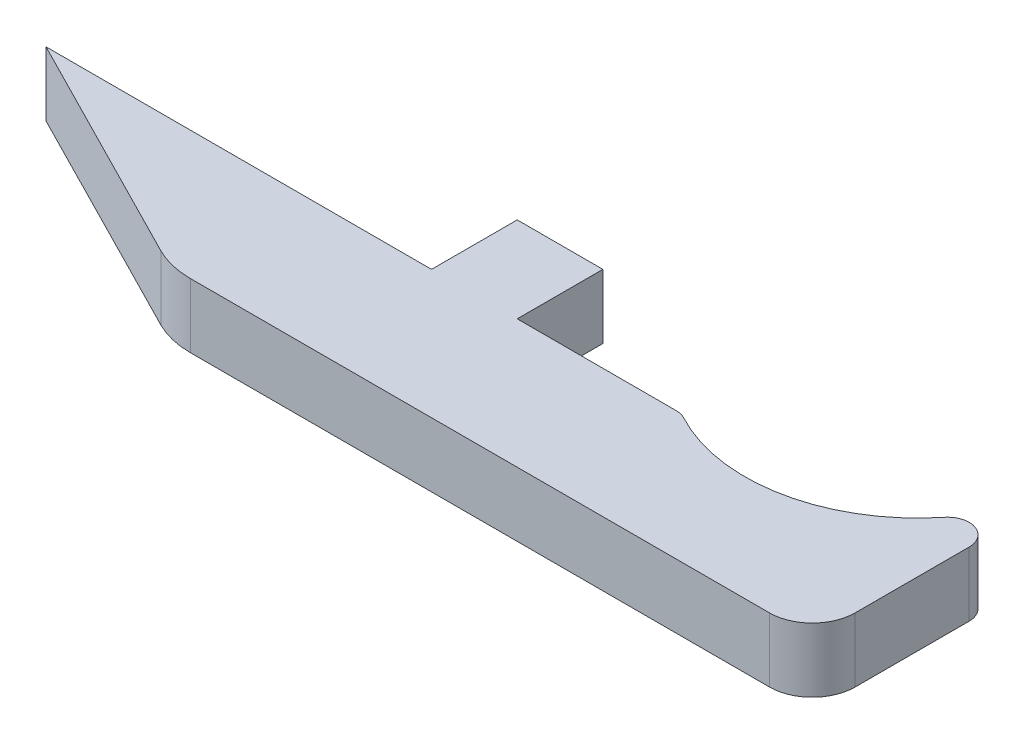
ISO-10303-21;
HEADER;
FILE_DESCRIPTION(('STEP AP214'),'2;1');
FILE_NAME('part.step','',(''),(''),'','','');
FILE_SCHEMA(('AUTOMOTIVE_DESIGN { 1 0 10303 214 1 1 1 1 }'));
ENDSEC;
DATA;
#1=APPLICATION_CONTEXT('core data for automotive mechanical design processes');
#2=APPLICATION_PROTOCOL_DEFINITION('international standard','automotive_design',2000,#1);
#3=PRODUCT_CONTEXT('',#1,'mechanical');
#4=PRODUCT('Part','Part','',(#3));
#5=PRODUCT_RELATED_PRODUCT_CATEGORY('part','',(#4));
#6=PRODUCT_DEFINITION_FORMATION('','',#4);
#7=PRODUCT_DEFINITION_CONTEXT('part definition',#1,'design');
#8=PRODUCT_DEFINITION('design','',#6,#7);
#9=PRODUCT_DEFINITION_SHAPE('','',#8);
#10=(LENGTH_UNIT() NAMED_UNIT(*) SI_UNIT(.MILLI.,.METRE.));
#11=(NAMED_UNIT(*) PLANE_ANGLE_UNIT() SI_UNIT($,.RADIAN.));
#12=(NAMED_UNIT(*) SI_UNIT($,.STERADIAN.) SOLID_ANGLE_UNIT());
#13=UNCERTAINTY_MEASURE_WITH_UNIT(LENGTH_MEASURE(1.E-05),#10,'distance_accuracy_value','');
#14=(GEOMETRIC_REPRESENTATION_CONTEXT(3) GLOBAL_UNCERTAINTY_ASSIGNED_CONTEXT((#13)) GLOBAL_UNIT_ASSIGNED_CONTEXT((#10,
#11,#12)) REPRESENTATION_CONTEXT('',''));
#15=CARTESIAN_POINT('',(0.,0.,0.));
#16=DIRECTION('',(0.,0.,1.));
#17=DIRECTION('',(1.,0.,0.));
#18=AXIS2_PLACEMENT_3D('',#15,#16,#17);
#19=CARTESIAN_POINT('',(0.,4.7625,13.8171684160711));
#20=DIRECTION('',(0.,0.,1.));
#21=DIRECTION('',(1.,0.,0.));
#22=AXIS2_PLACEMENT_3D('',#19,#20,#21);
#23=PLANE('',#22);
#24=DIRECTION('',(1.18015833326296E-13,-1.,0.));
#25=VECTOR('',#24,1.);
#26=CARTESIAN_POINT('',(40.4474999999188,4.7625,13.8171684160711));
#27=LINE('',#26,#25);
#28=CARTESIAN_POINT('',(40.4474999999194,4.7625,13.8171684160711));
#29=VERTEX_POINT('',#28);
#30=CARTESIAN_POINT('',(40.4474999999194,0.,13.8171684160711));
#31=VERTEX_POINT('',#30);
#32=EDGE_CURVE('E66',#29,#31,#27,.T.);
#33=ORIENTED_EDGE('',*,*,#32,.F.);
#34=DIRECTION('',(-1.,0.,0.));
#35=VECTOR('',#34,1.);
#36=CARTESIAN_POINT('',(0.,4.7625,13.8171684160711));
#37=LINE('',#36,#35);
#38=CARTESIAN_POINT('',(52.2236118690828,4.7625,13.8171684160711));
#39=VERTEX_POINT('',#38);
#40=EDGE_CURVE('E176',#39,#29,#37,.T.);
#41=ORIENTED_EDGE('',*,*,#40,.F.);
#42=DIRECTION('',(0.,1.,0.));
#43=VECTOR('',#42,1.);
#44=CARTESIAN_POINT('',(52.2236118690828,0.,13.8171684160711));
#45=LINE('',#44,#43);
#46=CARTESIAN_POINT('',(52.2236118690828,0.,13.8171684160711));
#47=VERTEX_POINT('',#46);
#48=EDGE_CURVE('E199',#39,#47,#45,.F.);
#49=ORIENTED_EDGE('',*,*,#48,.T.);
#50=DIRECTION('',(-1.,0.,0.));
#51=VECTOR('',#50,1.);
#52=CARTESIAN_POINT('',(0.,0.,13.8171684160711));
#53=LINE('',#52,#51);
#54=EDGE_CURVE('E188',#47,#31,#53,.T.);
#55=ORIENTED_EDGE('',*,*,#54,.T.);
#56=EDGE_LOOP('',(#33,#41,#49,#55));
#57=FACE_BOUND('',#56,.T.);
#58=ADVANCED_FACE('F43',(#57),#23,.F.);
#59=DIRECTION('',(-1.16558847729675E-13,1.,0.));
#60=VECTOR('',#59,1.);
#61=CARTESIAN_POINT('',(34.0974999999188,4.7625,13.8171684160711));
#62=LINE('',#61,#60);
#63=CARTESIAN_POINT('',(34.0974999999194,0.,13.8171684160711));
#64=VERTEX_POINT('',#63);
#65=CARTESIAN_POINT('',(34.0974999999188,4.7625,13.8171684160711));
#66=VERTEX_POINT('',#65);
#67=EDGE_CURVE('E160',#64,#66,#62,.T.);
#68=ORIENTED_EDGE('',*,*,#67,.F.);
#69=CARTESIAN_POINT('',(5.52249999991881,0.,13.8171684160711));
#70=VERTEX_POINT('',#69);
#71=EDGE_CURVE('E166',#64,#70,#53,.T.);
#72=ORIENTED_EDGE('',*,*,#71,.T.);
#73=DIRECTION('',(0.,-1.,0.));
#74=VECTOR('',#73,1.);
#75=CARTESIAN_POINT('',(5.52249999991881,4.7625,13.8171684160711));
#76=LINE('',#75,#74);
#77=CARTESIAN_POINT('',(5.52249999991881,4.7625,13.8171684160711));
#78=VERTEX_POINT('',#77);
#79=EDGE_CURVE('E186',#78,#70,#76,.T.);
#80=ORIENTED_EDGE('',*,*,#79,.F.);
#81=EDGE_CURVE('E58',#66,#78,#37,.T.);
#82=ORIENTED_EDGE('',*,*,#81,.F.);
#83=EDGE_LOOP('',(#68,#72,#80,#82));
#84=FACE_BOUND('',#83,.T.);
#85=ADVANCED_FACE('F271',(#84),#23,.F.);
#86=CARTESIAN_POINT('',(59.0180999999136,4.7625,2.69196841607107));
#87=DIRECTION('',(0.,-1.,0.));
#88=DIRECTION('',(0.,0.,-1.));
#89=AXIS2_PLACEMENT_3D('',#86,#87,#88);
#90=CYLINDRICAL_SURFACE('',#89,12.827);
#91=CARTESIAN_POINT('',(59.0180999999136,0.,2.69196841607107));
#92=DIRECTION('',(0.,1.,0.));
#93=DIRECTION('',(0.,0.,1.));
#94=AXIS2_PLACEMENT_3D('',#91,#92,#93);
#95=CIRCLE('',#94,12.827);
#96=CARTESIAN_POINT('',(52.9719035134474,0.,14.0045913235601));
#97=VERTEX_POINT('',#96);
#98=CARTESIAN_POINT('',(69.0197696034378,0.,10.7230663573204));
#99=VERTEX_POINT('',#98);
#100=EDGE_CURVE('E163',#97,#99,#95,.T.);
#101=ORIENTED_EDGE('',*,*,#100,.F.);
#102=DIRECTION('',(0.,-1.,0.));
#103=VECTOR('',#102,1.);
#104=CARTESIAN_POINT('',(52.9719035134474,4.7625,14.0045913235601));
#105=LINE('',#104,#103);
#106=CARTESIAN_POINT('',(52.9719035134474,4.7625,14.0045913235601));
#107=VERTEX_POINT('',#106);
#108=EDGE_CURVE('E209',#97,#107,#105,.F.);
#109=ORIENTED_EDGE('',*,*,#108,.T.);
#110=CARTESIAN_POINT('',(59.0180999999136,4.7625,2.69196841607107));
#111=DIRECTION('',(0.,1.,0.));
#112=DIRECTION('',(0.,0.,1.));
#113=AXIS2_PLACEMENT_3D('',#110,#111,#112);
#114=CIRCLE('',#113,12.827);
#115=CARTESIAN_POINT('',(69.0197696034378,4.7625,10.7230663573204));
#116=VERTEX_POINT('',#115);
#117=EDGE_CURVE('E172',#107,#116,#114,.T.);
#118=ORIENTED_EDGE('',*,*,#117,.T.);
#119=DIRECTION('',(0.,-1.,0.));
#120=VECTOR('',#119,1.);
#121=CARTESIAN_POINT('',(69.0197696034378,4.7625,10.7230663573204));
#122=LINE('',#121,#120);
#123=EDGE_CURVE('E206',#116,#99,#122,.T.);
#124=ORIENTED_EDGE('',*,*,#123,.T.);
#125=EDGE_LOOP('',(#101,#109,#118,#124));
#126=FACE_BOUND('',#125,.T.);
#127=ADVANCED_FACE('F253',(#126),#90,.F.);
#128=CARTESIAN_POINT('',(-4.45063872227655,4.7625,8.73661549329288));
#129=DIRECTION('',(0.453918499731843,0.,-0.891043206360496));
#130=DIRECTION('',(-0.891043206360496,0.,-0.453918499731843));
#131=AXIS2_PLACEMENT_3D('',#128,#129,#130);
#132=PLANE('',#131);
#133=DIRECTION('',(0.891043206360496,0.,0.453918499731843));
#134=VECTOR('',#133,1.);
#135=CARTESIAN_POINT('',(-4.45063872227655,0.,8.73661549329288));
#136=LINE('',#135,#134);
#137=CARTESIAN_POINT('',(22.8619463034113,0.,22.6502927764602));
#138=VERTEX_POINT('',#137);
#139=EDGE_CURVE('E190',#70,#138,#136,.T.);
#140=ORIENTED_EDGE('',*,*,#139,.T.);
#141=DIRECTION('',(0.,-1.,0.));
#142=VECTOR('',#141,1.);
#143=CARTESIAN_POINT('',(22.8619463034113,4.7625,22.6502927764602));
#144=LINE('',#143,#142);
#145=CARTESIAN_POINT('',(22.8619463034113,4.7625,22.6502927764602));
#146=VERTEX_POINT('',#145);
#147=EDGE_CURVE('E222',#138,#146,#144,.F.);
#148=ORIENTED_EDGE('',*,*,#147,.T.);
#149=DIRECTION('',(0.891043206360496,0.,0.453918499731843));
#150=VECTOR('',#149,1.);
#151=CARTESIAN_POINT('',(-4.45063872227655,4.7625,8.73661549329288));
#152=LINE('',#151,#150);
#153=EDGE_CURVE('E178',#78,#146,#152,.T.);
#154=ORIENTED_EDGE('',*,*,#153,.F.);
#155=ORIENTED_EDGE('',*,*,#79,.T.);
#156=EDGE_LOOP('',(#140,#148,#154,#155));
#157=FACE_BOUND('',#156,.T.);
#158=ADVANCED_FACE('F274',(#157),#132,.F.);
#159=CARTESIAN_POINT('',(0.,4.7625,23.3421684160711));
#160=DIRECTION('',(0.,0.,-1.));
#161=DIRECTION('',(-1.,0.,0.));
#162=AXIS2_PLACEMENT_3D('',#159,#160,#161);
#163=PLANE('',#162);
#164=DIRECTION('',(1.,0.,0.));
#165=VECTOR('',#164,1.);
#166=CARTESIAN_POINT('',(0.,0.,23.3421684160711));
#167=LINE('',#166,#165);
#168=CARTESIAN_POINT('',(25.7443287767085,0.,23.3421684160711));
#169=VERTEX_POINT('',#168);
#170=CARTESIAN_POINT('',(68.6700999999135,0.,23.3421684160711));
#171=VERTEX_POINT('',#170);
#172=EDGE_CURVE('E193',#169,#171,#167,.T.);
#173=ORIENTED_EDGE('',*,*,#172,.T.);
#174=DIRECTION('',(0.,-1.,0.));
#175=VECTOR('',#174,1.);
#176=CARTESIAN_POINT('',(68.6700999999135,4.7625,23.3421684160711));
#177=LINE('',#176,#175);
#178=CARTESIAN_POINT('',(68.6700999999135,4.7625,23.3421684160711));
#179=VERTEX_POINT('',#178);
#180=EDGE_CURVE('E51',#171,#179,#177,.F.);
#181=ORIENTED_EDGE('',*,*,#180,.T.);
#182=DIRECTION('',(1.,0.,0.));
#183=VECTOR('',#182,1.);
#184=CARTESIAN_POINT('',(0.,4.7625,23.3421684160711));
#185=LINE('',#184,#183);
#186=CARTESIAN_POINT('',(25.7443287767085,4.7625,23.3421684160711));
#187=VERTEX_POINT('',#186);
#188=EDGE_CURVE('E181',#187,#179,#185,.T.);
#189=ORIENTED_EDGE('',*,*,#188,.F.);
#190=DIRECTION('',(0.,-1.,0.));
#191=VECTOR('',#190,1.);
#192=CARTESIAN_POINT('',(25.7443287767085,4.7625,23.3421684160711));
#193=LINE('',#192,#191);
#194=EDGE_CURVE('E217',#187,#169,#193,.T.);
#195=ORIENTED_EDGE('',*,*,#194,.T.);
#196=EDGE_LOOP('',(#173,#181,#189,#195));
#197=FACE_BOUND('',#196,.T.);
#198=ADVANCED_FACE('F233',(#197),#163,.F.);
#199=CARTESIAN_POINT('',(71.8450999999136,4.7625,0.));
#200=DIRECTION('',(1.,0.,0.));
#201=DIRECTION('',(0.,0.,-1.));
#202=AXIS2_PLACEMENT_3D('',#199,#200,#201);
#203=PLANE('',#202);
#204=DIRECTION('',(0.,0.,1.));
#205=VECTOR('',#204,1.);
#206=CARTESIAN_POINT('',(71.8450999999136,4.7625,0.));
#207=LINE('',#206,#205);
#208=CARTESIAN_POINT('',(71.8450999999135,4.7625,11.7170141223265));
#209=VERTEX_POINT('',#208);
#210=CARTESIAN_POINT('',(71.8450999999135,4.7625,20.1671684160711));
#211=VERTEX_POINT('',#210);
#212=EDGE_CURVE('E184',#209,#211,#207,.T.);
#213=ORIENTED_EDGE('',*,*,#212,.T.);
#214=DIRECTION('',(0.,-1.,0.));
#215=VECTOR('',#214,1.);
#216=CARTESIAN_POINT('',(71.8450999999135,0.,20.1671684160711));
#217=LINE('',#216,#215);
#218=CARTESIAN_POINT('',(71.8450999999135,0.,20.1671684160711));
#219=VERTEX_POINT('',#218);
#220=EDGE_CURVE('E226',#211,#219,#217,.T.);
#221=ORIENTED_EDGE('',*,*,#220,.T.);
#222=DIRECTION('',(0.,0.,1.));
#223=VECTOR('',#222,1.);
#224=CARTESIAN_POINT('',(71.8450999999136,0.,0.));
#225=LINE('',#224,#223);
#226=CARTESIAN_POINT('',(71.8450999999135,0.,11.7170141223265));
#227=VERTEX_POINT('',#226);
#228=EDGE_CURVE('E175',#227,#219,#225,.T.);
#229=ORIENTED_EDGE('',*,*,#228,.F.);
#230=DIRECTION('',(0.,-1.,0.));
#231=VECTOR('',#230,1.);
#232=CARTESIAN_POINT('',(71.8450999999135,4.7625,11.7170141223265));
#233=LINE('',#232,#231);
#234=EDGE_CURVE('E215',#227,#209,#233,.F.);
#235=ORIENTED_EDGE('',*,*,#234,.T.);
#236=EDGE_LOOP('',(#213,#221,#229,#235));
#237=FACE_BOUND('',#236,.T.);
#238=ADVANCED_FACE('F245',(#237),#203,.T.);
#239=CARTESIAN_POINT('',(0.,4.7625,0.));
#240=DIRECTION('',(0.,1.,0.));
#241=DIRECTION('',(0.,0.,1.));
#242=AXIS2_PLACEMENT_3D('',#239,#240,#241);
#243=PLANE('',#242);
#244=ORIENTED_EDGE('',*,*,#188,.T.);
#245=CARTESIAN_POINT('',(68.6700999999135,4.7625,20.1671684160711));
#246=DIRECTION('',(0.,1.,0.));
#247=DIRECTION('',(0.,0.,1.));
#248=AXIS2_PLACEMENT_3D('',#245,#246,#247);
#249=CIRCLE('',#248,3.175);
#250=EDGE_CURVE('E11',#179,#211,#249,.T.);
#251=ORIENTED_EDGE('',*,*,#250,.T.);
#252=ORIENTED_EDGE('',*,*,#212,.F.);
#253=CARTESIAN_POINT('',(70.2575999999136,4.7625,11.7170141223265));
#254=DIRECTION('',(0.,1.,0.));
#255=DIRECTION('',(0.,0.,1.));
#256=AXIS2_PLACEMENT_3D('',#253,#254,#255);
#257=CIRCLE('',#256,1.5875);
#258=EDGE_CURVE('E211',#209,#116,#257,.T.);
#259=ORIENTED_EDGE('',*,*,#258,.T.);
#260=ORIENTED_EDGE('',*,*,#117,.F.);
#261=CARTESIAN_POINT('',(52.2236118690828,4.7625,15.4046684160711));
#262=DIRECTION('',(0.,1.,0.));
#263=DIRECTION('',(0.,0.,1.));
#264=AXIS2_PLACEMENT_3D('',#261,#262,#263);
#265=CIRCLE('',#264,1.5875);
#266=EDGE_CURVE('E213',#107,#39,#265,.T.);
#267=ORIENTED_EDGE('',*,*,#266,.T.);
#268=ORIENTED_EDGE('',*,*,#40,.T.);
#269=DIRECTION('',(0.,0.,1.));
#270=VECTOR('',#269,1.);
#271=CARTESIAN_POINT('',(40.4474999999188,4.7625,7.46716841607107));
#272=LINE('',#271,#270);
#273=CARTESIAN_POINT('',(40.4474999999188,4.7625,7.46716841607107));
#274=VERTEX_POINT('',#273);
#275=EDGE_CURVE('E260',#274,#29,#272,.T.);
#276=ORIENTED_EDGE('',*,*,#275,.F.);
#277=DIRECTION('',(1.,0.,0.));
#278=VECTOR('',#277,1.);
#279=CARTESIAN_POINT('',(40.4474999999188,4.7625,7.46716841607107));
#280=LINE('',#279,#278);
#281=CARTESIAN_POINT('',(34.0974999999188,4.7625,7.46716841607107));
#282=VERTEX_POINT('',#281);
#283=EDGE_CURVE('E156',#282,#274,#280,.T.);
#284=ORIENTED_EDGE('',*,*,#283,.F.);
#285=DIRECTION('',(0.,0.,1.));
#286=VECTOR('',#285,1.);
#287=CARTESIAN_POINT('',(34.0974999999188,4.7625,7.46716841607107));
#288=LINE('',#287,#286);
#289=EDGE_CURVE('E168',#282,#66,#288,.T.);
#290=ORIENTED_EDGE('',*,*,#289,.T.);
#291=ORIENTED_EDGE('',*,*,#81,.T.);
#292=ORIENTED_EDGE('',*,*,#153,.T.);
#293=CARTESIAN_POINT('',(25.7443287767085,4.7625,16.9921684160711));
#294=DIRECTION('',(0.,1.,0.));
#295=DIRECTION('',(0.,0.,1.));
#296=AXIS2_PLACEMENT_3D('',#293,#294,#295);
#297=CIRCLE('',#296,6.35);
#298=EDGE_CURVE('E224',#146,#187,#297,.T.);
#299=ORIENTED_EDGE('',*,*,#298,.T.);
#300=EDGE_LOOP('',(#244,#251,#252,#259,#260,#267,#268,#276,#284,#290,#291,#292,#299));
#301=FACE_BOUND('',#300,.T.);
#302=ADVANCED_FACE('F239',(#301),#243,.T.);
#303=CARTESIAN_POINT('',(0.,0.,0.));
#304=DIRECTION('',(0.,1.,0.));
#305=DIRECTION('',(0.,0.,1.));
#306=AXIS2_PLACEMENT_3D('',#303,#304,#305);
#307=PLANE('',#306);
#308=ORIENTED_EDGE('',*,*,#228,.T.);
#309=CARTESIAN_POINT('',(68.6700999999135,0.,20.1671684160711));
#310=DIRECTION('',(0.,1.,0.));
#311=DIRECTION('',(0.,0.,1.));
#312=AXIS2_PLACEMENT_3D('',#309,#310,#311);
#313=CIRCLE('',#312,3.175);
#314=EDGE_CURVE('E229',#219,#171,#313,.F.);
#315=ORIENTED_EDGE('',*,*,#314,.T.);
#316=ORIENTED_EDGE('',*,*,#172,.F.);
#317=CARTESIAN_POINT('',(25.7443287767085,0.,16.9921684160711));
#318=DIRECTION('',(0.,1.,0.));
#319=DIRECTION('',(0.,0.,1.));
#320=AXIS2_PLACEMENT_3D('',#317,#318,#319);
#321=CIRCLE('',#320,6.35);
#322=EDGE_CURVE('E220',#169,#138,#321,.F.);
#323=ORIENTED_EDGE('',*,*,#322,.T.);
#324=ORIENTED_EDGE('',*,*,#139,.F.);
#325=ORIENTED_EDGE('',*,*,#71,.F.);
#326=DIRECTION('',(0.,0.,1.));
#327=VECTOR('',#326,1.);
#328=CARTESIAN_POINT('',(34.0974999999194,0.,7.46716841607107));
#329=LINE('',#328,#327);
#330=CARTESIAN_POINT('',(34.0974999999194,0.,7.46716841607107));
#331=VERTEX_POINT('',#330);
#332=EDGE_CURVE('E147',#331,#64,#329,.T.);
#333=ORIENTED_EDGE('',*,*,#332,.F.);
#334=DIRECTION('',(-1.,0.,0.));
#335=VECTOR('',#334,1.);
#336=CARTESIAN_POINT('',(40.4474999999194,0.,7.46716841607107));
#337=LINE('',#336,#335);
#338=CARTESIAN_POINT('',(40.4474999999194,0.,7.46716841607107));
#339=VERTEX_POINT('',#338);
#340=EDGE_CURVE('E139',#339,#331,#337,.T.);
#341=ORIENTED_EDGE('',*,*,#340,.F.);
#342=DIRECTION('',(0.,0.,1.));
#343=VECTOR('',#342,1.);
#344=CARTESIAN_POINT('',(40.4474999999194,0.,7.46716841607107));
#345=LINE('',#344,#343);
#346=EDGE_CURVE('E145',#339,#31,#345,.T.);
#347=ORIENTED_EDGE('',*,*,#346,.T.);
#348=ORIENTED_EDGE('',*,*,#54,.F.);
#349=CARTESIAN_POINT('',(52.2236118690828,0.,15.4046684160711));
#350=DIRECTION('',(0.,1.,0.));
#351=DIRECTION('',(0.,0.,1.));
#352=AXIS2_PLACEMENT_3D('',#349,#350,#351);
#353=CIRCLE('',#352,1.5875);
#354=EDGE_CURVE('E204',#47,#97,#353,.F.);
#355=ORIENTED_EDGE('',*,*,#354,.T.);
#356=ORIENTED_EDGE('',*,*,#100,.T.);
#357=CARTESIAN_POINT('',(70.2575999999136,0.,11.7170141223265));
#358=DIRECTION('',(0.,1.,0.));
#359=DIRECTION('',(0.,0.,1.));
#360=AXIS2_PLACEMENT_3D('',#357,#358,#359);
#361=CIRCLE('',#360,1.5875);
#362=EDGE_CURVE('E202',#99,#227,#361,.F.);
#363=ORIENTED_EDGE('',*,*,#362,.T.);
#364=EDGE_LOOP('',(#308,#315,#316,#323,#324,#325,#333,#341,#347,#348,#355,#356,#363));
#365=FACE_BOUND('',#364,.T.);
#366=ADVANCED_FACE('F142',(#365),#307,.F.);
#367=CARTESIAN_POINT('',(52.2236118690828,4.7625,15.4046684160711));
#368=DIRECTION('',(0.,-1.,0.));
#369=DIRECTION('',(0.,0.,-1.));
#370=AXIS2_PLACEMENT_3D('',#367,#368,#369);
#371=CYLINDRICAL_SURFACE('',#370,1.5875);
#372=ORIENTED_EDGE('',*,*,#266,.F.);
#373=ORIENTED_EDGE('',*,*,#108,.F.);
#374=ORIENTED_EDGE('',*,*,#354,.F.);
#375=ORIENTED_EDGE('',*,*,#48,.F.);
#376=EDGE_LOOP('',(#372,#373,#374,#375));
#377=FACE_BOUND('',#376,.T.);
#378=ADVANCED_FACE('F259',(#377),#371,.T.);
#379=CARTESIAN_POINT('',(70.2575999999136,4.7625,11.7170141223265));
#380=DIRECTION('',(0.,-1.,0.));
#381=DIRECTION('',(0.,0.,-1.));
#382=AXIS2_PLACEMENT_3D('',#379,#380,#381);
#383=CYLINDRICAL_SURFACE('',#382,1.5875);
#384=ORIENTED_EDGE('',*,*,#258,.F.);
#385=ORIENTED_EDGE('',*,*,#234,.F.);
#386=ORIENTED_EDGE('',*,*,#362,.F.);
#387=ORIENTED_EDGE('',*,*,#123,.F.);
#388=EDGE_LOOP('',(#384,#385,#386,#387));
#389=FACE_BOUND('',#388,.T.);
#390=ADVANCED_FACE('F251',(#389),#383,.T.);
#391=CARTESIAN_POINT('',(25.7443287767085,4.7625,16.9921684160711));
#392=DIRECTION('',(0.,-1.,0.));
#393=DIRECTION('',(0.,0.,-1.));
#394=AXIS2_PLACEMENT_3D('',#391,#392,#393);
#395=CYLINDRICAL_SURFACE('',#394,6.35);
#396=ORIENTED_EDGE('',*,*,#298,.F.);
#397=ORIENTED_EDGE('',*,*,#147,.F.);
#398=ORIENTED_EDGE('',*,*,#322,.F.);
#399=ORIENTED_EDGE('',*,*,#194,.F.);
#400=EDGE_LOOP('',(#396,#397,#398,#399));
#401=FACE_BOUND('',#400,.T.);
#402=ADVANCED_FACE('F277',(#401),#395,.T.);
#403=CARTESIAN_POINT('',(68.6700999999135,4.7625,20.1671684160711));
#404=DIRECTION('',(0.,1.,0.));
#405=DIRECTION('',(0.,0.,1.));
#406=AXIS2_PLACEMENT_3D('',#403,#404,#405);
#407=CYLINDRICAL_SURFACE('',#406,3.175);
#408=ORIENTED_EDGE('',*,*,#250,.F.);
#409=ORIENTED_EDGE('',*,*,#180,.F.);
#410=ORIENTED_EDGE('',*,*,#314,.F.);
#411=ORIENTED_EDGE('',*,*,#220,.F.);
#412=EDGE_LOOP('',(#408,#409,#410,#411));
#413=FACE_BOUND('',#412,.T.);
#414=ADVANCED_FACE('F45',(#413),#407,.T.);
#415=CARTESIAN_POINT('',(40.4474999999188,4.7625,7.46716841607107));
#416=DIRECTION('',(-1.,-1.18015833326296E-13,0.));
#417=DIRECTION('',(1.18015833326296E-13,-1.,0.));
#418=AXIS2_PLACEMENT_3D('',#415,#416,#417);
#419=PLANE('',#418);
#420=ORIENTED_EDGE('',*,*,#32,.T.);
#421=ORIENTED_EDGE('',*,*,#346,.F.);
#422=DIRECTION('',(1.18015833326296E-13,-1.,0.));
#423=VECTOR('',#422,1.);
#424=CARTESIAN_POINT('',(40.4474999999188,4.7625,7.46716841607107));
#425=LINE('',#424,#423);
#426=EDGE_CURVE('E151',#274,#339,#425,.T.);
#427=ORIENTED_EDGE('',*,*,#426,.F.);
#428=ORIENTED_EDGE('',*,*,#275,.T.);
#429=EDGE_LOOP('',(#420,#421,#427,#428));
#430=FACE_BOUND('',#429,.T.);
#431=ADVANCED_FACE('F162',(#430),#419,.F.);
#432=CARTESIAN_POINT('',(34.0974999999188,4.7625,7.46716841607107));
#433=DIRECTION('',(1.,1.16558847729675E-13,0.));
#434=DIRECTION('',(-1.16558847729675E-13,1.,0.));
#435=AXIS2_PLACEMENT_3D('',#432,#433,#434);
#436=PLANE('',#435);
#437=ORIENTED_EDGE('',*,*,#67,.T.);
#438=ORIENTED_EDGE('',*,*,#289,.F.);
#439=DIRECTION('',(-1.16558847729675E-13,1.,0.));
#440=VECTOR('',#439,1.);
#441=CARTESIAN_POINT('',(34.0974999999188,4.7625,7.46716841607107));
#442=LINE('',#441,#440);
#443=EDGE_CURVE('E150',#331,#282,#442,.T.);
#444=ORIENTED_EDGE('',*,*,#443,.F.);
#445=ORIENTED_EDGE('',*,*,#332,.T.);
#446=EDGE_LOOP('',(#437,#438,#444,#445));
#447=FACE_BOUND('',#446,.T.);
#448=ADVANCED_FACE('F269',(#447),#436,.F.);
#449=CARTESIAN_POINT('',(0.,0.,7.46716841607108));
#450=DIRECTION('',(0.,0.,-1.));
#451=DIRECTION('',(-1.,0.,0.));
#452=AXIS2_PLACEMENT_3D('',#449,#450,#451);
#453=PLANE('',#452);
#454=ORIENTED_EDGE('',*,*,#426,.T.);
#455=ORIENTED_EDGE('',*,*,#340,.T.);
#456=ORIENTED_EDGE('',*,*,#443,.T.);
#457=ORIENTED_EDGE('',*,*,#283,.T.);
#458=EDGE_LOOP('',(#454,#455,#456,#457));
#459=FACE_BOUND('',#458,.T.);
#460=ADVANCED_FACE('F154',(#459),#453,.T.);
#461=CLOSED_SHELL('',(#58,#85,#127,#158,#198,#238,#302,#366,#378,#390,#402,#414,#431,#448,#460));
#462=MANIFOLD_SOLID_BREP('B2',#461);
#463=ADVANCED_BREP_SHAPE_REPRESENTATION('',(#18,#462),#14);
#464=SHAPE_DEFINITION_REPRESENTATION(#9,#463);
ENDSEC;
END-ISO-10303-21;
